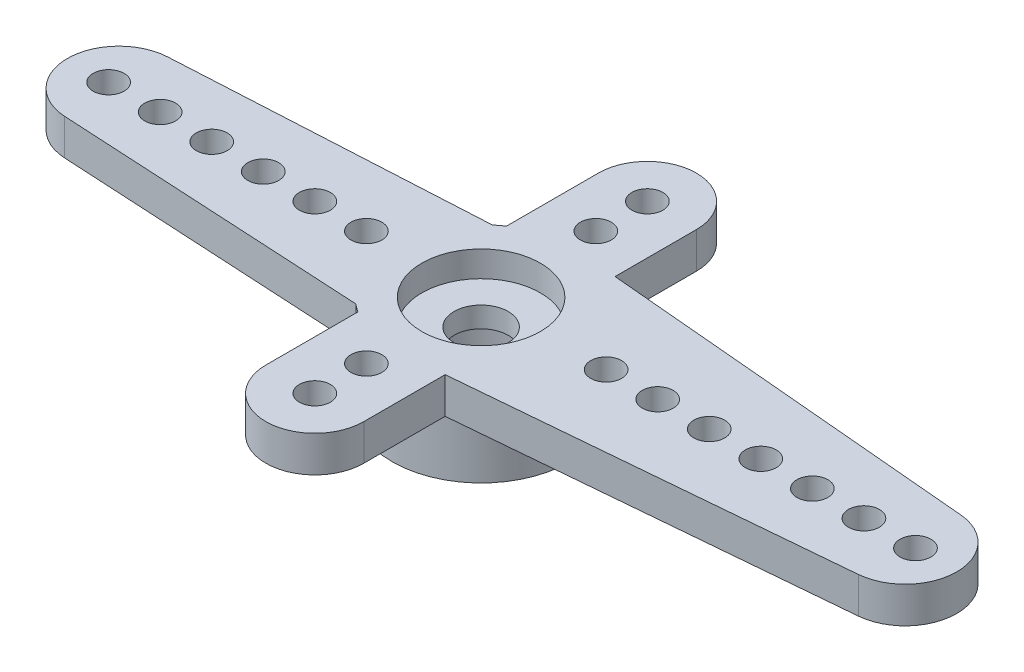
ISO-10303-21;
HEADER;
FILE_DESCRIPTION(('STEP AP214'),'2;1');
FILE_NAME('part.step','',(''),(''),'','','');
FILE_SCHEMA(('AUTOMOTIVE_DESIGN { 1 0 10303 214 1 1 1 1 }'));
ENDSEC;
DATA;
#1=APPLICATION_CONTEXT('core data for automotive mechanical design processes');
#2=APPLICATION_PROTOCOL_DEFINITION('international standard','automotive_design',2000,#1);
#3=PRODUCT_CONTEXT('',#1,'mechanical');
#4=PRODUCT('Part','Part','',(#3));
#5=PRODUCT_RELATED_PRODUCT_CATEGORY('part','',(#4));
#6=PRODUCT_DEFINITION_FORMATION('','',#4);
#7=PRODUCT_DEFINITION_CONTEXT('part definition',#1,'design');
#8=PRODUCT_DEFINITION('design','',#6,#7);
#9=PRODUCT_DEFINITION_SHAPE('','',#8);
#10=(LENGTH_UNIT() NAMED_UNIT(*) SI_UNIT(.MILLI.,.METRE.));
#11=(NAMED_UNIT(*) PLANE_ANGLE_UNIT() SI_UNIT($,.RADIAN.));
#12=(NAMED_UNIT(*) SI_UNIT($,.STERADIAN.) SOLID_ANGLE_UNIT());
#13=UNCERTAINTY_MEASURE_WITH_UNIT(LENGTH_MEASURE(1.E-05),#10,'distance_accuracy_value','');
#14=(GEOMETRIC_REPRESENTATION_CONTEXT(3) GLOBAL_UNCERTAINTY_ASSIGNED_CONTEXT((#13)) GLOBAL_UNIT_ASSIGNED_CONTEXT((#10,
#11,#12)) REPRESENTATION_CONTEXT('',''));
#15=CARTESIAN_POINT('',(0.,0.,0.));
#16=DIRECTION('',(0.,0.,1.));
#17=DIRECTION('',(1.,0.,0.));
#18=AXIS2_PLACEMENT_3D('',#15,#16,#17);
#19=CARTESIAN_POINT('',(4.85000000000001,0.,0.));
#20=DIRECTION('',(0.,1.,0.));
#21=DIRECTION('',(0.,0.,1.));
#22=AXIS2_PLACEMENT_3D('',#19,#20,#21);
#23=CYLINDRICAL_SURFACE('',#22,0.600000000000014);
#24=CARTESIAN_POINT('',(4.85000000000001,0.,0.));
#25=DIRECTION('',(0.,1.,0.));
#26=DIRECTION('',(0.,0.,1.));
#27=AXIS2_PLACEMENT_3D('',#24,#25,#26);
#28=CIRCLE('',#27,0.600000000000014);
#29=CARTESIAN_POINT('',(4.85000000000001,0.,0.600000000000014));
#30=VERTEX_POINT('',#29);
#31=EDGE_CURVE('E47',#30,#30,#28,.T.);
#32=ORIENTED_EDGE('',*,*,#31,.T.);
#33=EDGE_LOOP('',(#32));
#34=FACE_BOUND('',#33,.T.);
#35=CARTESIAN_POINT('',(4.85000000000001,-1.4,0.));
#36=DIRECTION('',(0.,1.,0.));
#37=DIRECTION('',(0.,0.,1.));
#38=AXIS2_PLACEMENT_3D('',#35,#36,#37);
#39=CIRCLE('',#38,0.600000000000014);
#40=CARTESIAN_POINT('',(4.85000000000001,-1.4,0.600000000000014));
#41=VERTEX_POINT('',#40);
#42=EDGE_CURVE('E12',#41,#41,#39,.T.);
#43=ORIENTED_EDGE('',*,*,#42,.F.);
#44=EDGE_LOOP('',(#43));
#45=FACE_BOUND('',#44,.T.);
#46=ADVANCED_FACE('F39',(#34,#45),#23,.F.);
#47=CARTESIAN_POINT('',(6.85000000000001,0.,0.));
#48=DIRECTION('',(0.,1.,0.));
#49=DIRECTION('',(0.,0.,1.));
#50=AXIS2_PLACEMENT_3D('',#47,#48,#49);
#51=CYLINDRICAL_SURFACE('',#50,0.600000000000014);
#52=CARTESIAN_POINT('',(6.85000000000001,0.,0.));
#53=DIRECTION('',(0.,1.,0.));
#54=DIRECTION('',(0.,0.,1.));
#55=AXIS2_PLACEMENT_3D('',#52,#53,#54);
#56=CIRCLE('',#55,0.600000000000014);
#57=CARTESIAN_POINT('',(6.85000000000001,0.,0.600000000000014));
#58=VERTEX_POINT('',#57);
#59=EDGE_CURVE('E322',#58,#58,#56,.T.);
#60=ORIENTED_EDGE('',*,*,#59,.T.);
#61=EDGE_LOOP('',(#60));
#62=FACE_BOUND('',#61,.T.);
#63=CARTESIAN_POINT('',(6.85000000000001,-1.4,0.));
#64=DIRECTION('',(0.,1.,0.));
#65=DIRECTION('',(0.,0.,1.));
#66=AXIS2_PLACEMENT_3D('',#63,#64,#65);
#67=CIRCLE('',#66,0.600000000000014);
#68=CARTESIAN_POINT('',(6.85000000000001,-1.4,0.600000000000014));
#69=VERTEX_POINT('',#68);
#70=EDGE_CURVE('E325',#69,#69,#67,.T.);
#71=ORIENTED_EDGE('',*,*,#70,.F.);
#72=EDGE_LOOP('',(#71));
#73=FACE_BOUND('',#72,.T.);
#74=ADVANCED_FACE('F399',(#62,#73),#51,.F.);
#75=CARTESIAN_POINT('',(8.85000000000001,0.,0.));
#76=DIRECTION('',(0.,1.,0.));
#77=DIRECTION('',(0.,0.,1.));
#78=AXIS2_PLACEMENT_3D('',#75,#76,#77);
#79=CYLINDRICAL_SURFACE('',#78,0.600000000000014);
#80=CARTESIAN_POINT('',(8.85000000000001,0.,0.));
#81=DIRECTION('',(0.,1.,0.));
#82=DIRECTION('',(0.,0.,1.));
#83=AXIS2_PLACEMENT_3D('',#80,#81,#82);
#84=CIRCLE('',#83,0.600000000000014);
#85=CARTESIAN_POINT('',(8.85000000000001,0.,0.600000000000014));
#86=VERTEX_POINT('',#85);
#87=EDGE_CURVE('E316',#86,#86,#84,.T.);
#88=ORIENTED_EDGE('',*,*,#87,.T.);
#89=EDGE_LOOP('',(#88));
#90=FACE_BOUND('',#89,.T.);
#91=CARTESIAN_POINT('',(8.85000000000001,-1.4,0.));
#92=DIRECTION('',(0.,1.,0.));
#93=DIRECTION('',(0.,0.,1.));
#94=AXIS2_PLACEMENT_3D('',#91,#92,#93);
#95=CIRCLE('',#94,0.600000000000014);
#96=CARTESIAN_POINT('',(8.85000000000001,-1.4,0.600000000000014));
#97=VERTEX_POINT('',#96);
#98=EDGE_CURVE('E319',#97,#97,#95,.T.);
#99=ORIENTED_EDGE('',*,*,#98,.F.);
#100=EDGE_LOOP('',(#99));
#101=FACE_BOUND('',#100,.T.);
#102=ADVANCED_FACE('F404',(#90,#101),#79,.F.);
#103=CARTESIAN_POINT('',(10.85,0.,0.));
#104=DIRECTION('',(0.,1.,0.));
#105=DIRECTION('',(0.,0.,1.));
#106=AXIS2_PLACEMENT_3D('',#103,#104,#105);
#107=CYLINDRICAL_SURFACE('',#106,0.600000000000014);
#108=CARTESIAN_POINT('',(10.85,0.,0.));
#109=DIRECTION('',(0.,1.,0.));
#110=DIRECTION('',(0.,0.,1.));
#111=AXIS2_PLACEMENT_3D('',#108,#109,#110);
#112=CIRCLE('',#111,0.600000000000014);
#113=CARTESIAN_POINT('',(10.85,0.,0.600000000000014));
#114=VERTEX_POINT('',#113);
#115=EDGE_CURVE('E310',#114,#114,#112,.T.);
#116=ORIENTED_EDGE('',*,*,#115,.T.);
#117=EDGE_LOOP('',(#116));
#118=FACE_BOUND('',#117,.T.);
#119=CARTESIAN_POINT('',(10.85,-1.4,0.));
#120=DIRECTION('',(0.,1.,0.));
#121=DIRECTION('',(0.,0.,1.));
#122=AXIS2_PLACEMENT_3D('',#119,#120,#121);
#123=CIRCLE('',#122,0.600000000000014);
#124=CARTESIAN_POINT('',(10.85,-1.4,0.600000000000014));
#125=VERTEX_POINT('',#124);
#126=EDGE_CURVE('E313',#125,#125,#123,.T.);
#127=ORIENTED_EDGE('',*,*,#126,.F.);
#128=EDGE_LOOP('',(#127));
#129=FACE_BOUND('',#128,.T.);
#130=ADVANCED_FACE('F548',(#118,#129),#107,.F.);
#131=CARTESIAN_POINT('',(12.85,0.,0.));
#132=DIRECTION('',(0.,1.,0.));
#133=DIRECTION('',(0.,0.,1.));
#134=AXIS2_PLACEMENT_3D('',#131,#132,#133);
#135=CYLINDRICAL_SURFACE('',#134,0.600000000000014);
#136=CARTESIAN_POINT('',(12.85,0.,0.));
#137=DIRECTION('',(0.,1.,0.));
#138=DIRECTION('',(0.,0.,1.));
#139=AXIS2_PLACEMENT_3D('',#136,#137,#138);
#140=CIRCLE('',#139,0.600000000000014);
#141=CARTESIAN_POINT('',(12.85,0.,0.600000000000014));
#142=VERTEX_POINT('',#141);
#143=EDGE_CURVE('E304',#142,#142,#140,.T.);
#144=ORIENTED_EDGE('',*,*,#143,.T.);
#145=EDGE_LOOP('',(#144));
#146=FACE_BOUND('',#145,.T.);
#147=CARTESIAN_POINT('',(12.85,-1.4,0.));
#148=DIRECTION('',(0.,1.,0.));
#149=DIRECTION('',(0.,0.,1.));
#150=AXIS2_PLACEMENT_3D('',#147,#148,#149);
#151=CIRCLE('',#150,0.600000000000014);
#152=CARTESIAN_POINT('',(12.85,-1.4,0.600000000000014));
#153=VERTEX_POINT('',#152);
#154=EDGE_CURVE('E307',#153,#153,#151,.T.);
#155=ORIENTED_EDGE('',*,*,#154,.F.);
#156=EDGE_LOOP('',(#155));
#157=FACE_BOUND('',#156,.T.);
#158=ADVANCED_FACE('F539',(#146,#157),#135,.F.);
#159=CARTESIAN_POINT('',(0.,-1.4,0.));
#160=DIRECTION('',(0.,1.,0.));
#161=DIRECTION('',(0.,0.,1.));
#162=AXIS2_PLACEMENT_3D('',#159,#160,#161);
#163=CYLINDRICAL_SURFACE('',#162,3.45);
#164=DIRECTION('',(0.,1.,0.));
#165=VECTOR('',#164,1.);
#166=CARTESIAN_POINT('',(-1.9,-1.4,-2.87967011999638));
#167=LINE('',#166,#165);
#168=CARTESIAN_POINT('',(-1.9,-1.4,-2.87967011999638));
#169=VERTEX_POINT('',#168);
#170=CARTESIAN_POINT('',(-1.9,0.,-2.87967011999639));
#171=VERTEX_POINT('',#170);
#172=EDGE_CURVE('E200',#169,#171,#167,.T.);
#173=ORIENTED_EDGE('',*,*,#172,.F.);
#174=CARTESIAN_POINT('',(0.,-1.4,0.));
#175=DIRECTION('',(0.,1.,0.));
#176=DIRECTION('',(0.,0.,1.));
#177=AXIS2_PLACEMENT_3D('',#174,#175,#176);
#178=CIRCLE('',#177,3.45);
#179=CARTESIAN_POINT('',(-1.9,-1.4,2.87967011999639));
#180=VERTEX_POINT('',#179);
#181=EDGE_CURVE('E223',#180,#169,#178,.T.);
#182=ORIENTED_EDGE('',*,*,#181,.F.);
#183=DIRECTION('',(0.,1.,0.));
#184=VECTOR('',#183,1.);
#185=CARTESIAN_POINT('',(-1.9,-1.4,2.87967011999639));
#186=LINE('',#185,#184);
#187=CARTESIAN_POINT('',(-1.9,0.,2.87967011999639));
#188=VERTEX_POINT('',#187);
#189=EDGE_CURVE('E202',#188,#180,#186,.F.);
#190=ORIENTED_EDGE('',*,*,#189,.F.);
#191=CARTESIAN_POINT('',(0.,0.,0.));
#192=DIRECTION('',(0.,1.,0.));
#193=DIRECTION('',(0.,0.,1.));
#194=AXIS2_PLACEMENT_3D('',#191,#192,#193);
#195=CIRCLE('',#194,3.45);
#196=CARTESIAN_POINT('',(-2.20907220343745,0.,2.65));
#197=VERTEX_POINT('',#196);
#198=EDGE_CURVE('E265',#197,#188,#195,.T.);
#199=ORIENTED_EDGE('',*,*,#198,.F.);
#200=DIRECTION('',(0.,1.,0.));
#201=VECTOR('',#200,1.);
#202=CARTESIAN_POINT('',(-2.20907220343745,-1.4,2.65));
#203=LINE('',#202,#201);
#204=CARTESIAN_POINT('',(-2.20907220343745,-1.4,2.65));
#205=VERTEX_POINT('',#204);
#206=EDGE_CURVE('E82',#205,#197,#203,.T.);
#207=ORIENTED_EDGE('',*,*,#206,.F.);
#208=CARTESIAN_POINT('',(0.,-1.4,0.));
#209=DIRECTION('',(0.,-1.,0.));
#210=DIRECTION('',(0.,0.,-1.));
#211=AXIS2_PLACEMENT_3D('',#208,#209,#210);
#212=CIRCLE('',#211,3.45);
#213=CARTESIAN_POINT('',(-2.20907220343745,-1.4,-2.65));
#214=VERTEX_POINT('',#213);
#215=EDGE_CURVE('E88',#205,#214,#212,.T.);
#216=ORIENTED_EDGE('',*,*,#215,.T.);
#217=DIRECTION('',(0.,1.,0.));
#218=VECTOR('',#217,1.);
#219=CARTESIAN_POINT('',(-2.20907220343745,-1.4,-2.65));
#220=LINE('',#219,#218);
#221=CARTESIAN_POINT('',(-2.20907220343745,0.,-2.65));
#222=VERTEX_POINT('',#221);
#223=EDGE_CURVE('E264',#214,#222,#220,.T.);
#224=ORIENTED_EDGE('',*,*,#223,.T.);
#225=EDGE_CURVE('E255',#171,#222,#195,.T.);
#226=ORIENTED_EDGE('',*,*,#225,.F.);
#227=EDGE_LOOP('',(#173,#182,#190,#199,#207,#216,#224,#226));
#228=FACE_BOUND('',#227,.T.);
#229=CARTESIAN_POINT('',(0.,-3.8,0.));
#230=DIRECTION('',(0.,1.,0.));
#231=DIRECTION('',(0.,0.,1.));
#232=AXIS2_PLACEMENT_3D('',#229,#230,#231);
#233=CIRCLE('',#232,3.45);
#234=CARTESIAN_POINT('',(0.,-3.8,3.45));
#235=VERTEX_POINT('',#234);
#236=EDGE_CURVE('E252',#235,#235,#233,.T.);
#237=ORIENTED_EDGE('',*,*,#236,.T.);
#238=EDGE_LOOP('',(#237));
#239=FACE_BOUND('',#238,.T.);
#240=ADVANCED_FACE('F376',(#228,#239),#163,.T.);
#241=CARTESIAN_POINT('',(-4.45,0.,0.));
#242=DIRECTION('',(0.,1.,0.));
#243=DIRECTION('',(0.,0.,1.));
#244=AXIS2_PLACEMENT_3D('',#241,#242,#243);
#245=CYLINDRICAL_SURFACE('',#244,0.600000000000014);
#246=CARTESIAN_POINT('',(-4.45,0.,0.));
#247=DIRECTION('',(0.,1.,0.));
#248=DIRECTION('',(0.,0.,1.));
#249=AXIS2_PLACEMENT_3D('',#246,#247,#248);
#250=CIRCLE('',#249,0.600000000000014);
#251=CARTESIAN_POINT('',(-4.45,0.,0.600000000000014));
#252=VERTEX_POINT('',#251);
#253=EDGE_CURVE('E298',#252,#252,#250,.T.);
#254=ORIENTED_EDGE('',*,*,#253,.T.);
#255=EDGE_LOOP('',(#254));
#256=FACE_BOUND('',#255,.T.);
#257=CARTESIAN_POINT('',(-4.45,-1.4,0.));
#258=DIRECTION('',(0.,1.,0.));
#259=DIRECTION('',(0.,0.,1.));
#260=AXIS2_PLACEMENT_3D('',#257,#258,#259);
#261=CIRCLE('',#260,0.600000000000014);
#262=CARTESIAN_POINT('',(-4.45,-1.4,0.600000000000014));
#263=VERTEX_POINT('',#262);
#264=EDGE_CURVE('E301',#263,#263,#261,.T.);
#265=ORIENTED_EDGE('',*,*,#264,.F.);
#266=EDGE_LOOP('',(#265));
#267=FACE_BOUND('',#266,.T.);
#268=ADVANCED_FACE('F538',(#256,#267),#245,.F.);
#269=CARTESIAN_POINT('',(-6.45,0.,0.));
#270=DIRECTION('',(0.,1.,0.));
#271=DIRECTION('',(0.,0.,1.));
#272=AXIS2_PLACEMENT_3D('',#269,#270,#271);
#273=CYLINDRICAL_SURFACE('',#272,0.600000000000014);
#274=CARTESIAN_POINT('',(-6.45,0.,0.));
#275=DIRECTION('',(0.,1.,0.));
#276=DIRECTION('',(0.,0.,1.));
#277=AXIS2_PLACEMENT_3D('',#274,#275,#276);
#278=CIRCLE('',#277,0.600000000000014);
#279=CARTESIAN_POINT('',(-6.45,0.,0.600000000000014));
#280=VERTEX_POINT('',#279);
#281=EDGE_CURVE('E292',#280,#280,#278,.T.);
#282=ORIENTED_EDGE('',*,*,#281,.T.);
#283=EDGE_LOOP('',(#282));
#284=FACE_BOUND('',#283,.T.);
#285=CARTESIAN_POINT('',(-6.45,-1.4,0.));
#286=DIRECTION('',(0.,1.,0.));
#287=DIRECTION('',(0.,0.,1.));
#288=AXIS2_PLACEMENT_3D('',#285,#286,#287);
#289=CIRCLE('',#288,0.600000000000014);
#290=CARTESIAN_POINT('',(-6.45,-1.4,0.600000000000014));
#291=VERTEX_POINT('',#290);
#292=EDGE_CURVE('E295',#291,#291,#289,.T.);
#293=ORIENTED_EDGE('',*,*,#292,.F.);
#294=EDGE_LOOP('',(#293));
#295=FACE_BOUND('',#294,.T.);
#296=ADVANCED_FACE('F545',(#284,#295),#273,.F.);
#297=CARTESIAN_POINT('',(-8.45,0.,0.));
#298=DIRECTION('',(0.,1.,0.));
#299=DIRECTION('',(0.,0.,1.));
#300=AXIS2_PLACEMENT_3D('',#297,#298,#299);
#301=CYLINDRICAL_SURFACE('',#300,0.600000000000014);
#302=CARTESIAN_POINT('',(-8.45,0.,0.));
#303=DIRECTION('',(0.,1.,0.));
#304=DIRECTION('',(0.,0.,1.));
#305=AXIS2_PLACEMENT_3D('',#302,#303,#304);
#306=CIRCLE('',#305,0.600000000000014);
#307=CARTESIAN_POINT('',(-8.45,0.,0.600000000000014));
#308=VERTEX_POINT('',#307);
#309=EDGE_CURVE('E286',#308,#308,#306,.T.);
#310=ORIENTED_EDGE('',*,*,#309,.T.);
#311=EDGE_LOOP('',(#310));
#312=FACE_BOUND('',#311,.T.);
#313=CARTESIAN_POINT('',(-8.45,-1.4,0.));
#314=DIRECTION('',(0.,1.,0.));
#315=DIRECTION('',(0.,0.,1.));
#316=AXIS2_PLACEMENT_3D('',#313,#314,#315);
#317=CIRCLE('',#316,0.600000000000014);
#318=CARTESIAN_POINT('',(-8.45,-1.4,0.600000000000014));
#319=VERTEX_POINT('',#318);
#320=EDGE_CURVE('E289',#319,#319,#317,.T.);
#321=ORIENTED_EDGE('',*,*,#320,.F.);
#322=EDGE_LOOP('',(#321));
#323=FACE_BOUND('',#322,.T.);
#324=ADVANCED_FACE('F554',(#312,#323),#301,.F.);
#325=CARTESIAN_POINT('',(-10.45,0.,0.));
#326=DIRECTION('',(0.,1.,0.));
#327=DIRECTION('',(0.,0.,1.));
#328=AXIS2_PLACEMENT_3D('',#325,#326,#327);
#329=CYLINDRICAL_SURFACE('',#328,0.600000000000014);
#330=CARTESIAN_POINT('',(-10.45,0.,0.));
#331=DIRECTION('',(0.,1.,0.));
#332=DIRECTION('',(0.,0.,1.));
#333=AXIS2_PLACEMENT_3D('',#330,#331,#332);
#334=CIRCLE('',#333,0.600000000000014);
#335=CARTESIAN_POINT('',(-10.45,0.,0.600000000000014));
#336=VERTEX_POINT('',#335);
#337=EDGE_CURVE('E276',#336,#336,#334,.T.);
#338=ORIENTED_EDGE('',*,*,#337,.T.);
#339=EDGE_LOOP('',(#338));
#340=FACE_BOUND('',#339,.T.);
#341=CARTESIAN_POINT('',(-10.45,-1.4,0.));
#342=DIRECTION('',(0.,1.,0.));
#343=DIRECTION('',(0.,0.,1.));
#344=AXIS2_PLACEMENT_3D('',#341,#342,#343);
#345=CIRCLE('',#344,0.600000000000014);
#346=CARTESIAN_POINT('',(-10.45,-1.4,0.600000000000014));
#347=VERTEX_POINT('',#346);
#348=EDGE_CURVE('E283',#347,#347,#345,.T.);
#349=ORIENTED_EDGE('',*,*,#348,.F.);
#350=EDGE_LOOP('',(#349));
#351=FACE_BOUND('',#350,.T.);
#352=ADVANCED_FACE('F394',(#340,#351),#329,.F.);
#353=CARTESIAN_POINT('',(0.,-1.4,0.));
#354=DIRECTION('',(0.,1.,0.));
#355=DIRECTION('',(0.,0.,1.));
#356=AXIS2_PLACEMENT_3D('',#353,#354,#355);
#357=PLANE('',#356);
#358=CARTESIAN_POINT('',(-12.45,-1.4,0.));
#359=DIRECTION('',(0.,1.,0.));
#360=DIRECTION('',(0.,0.,1.));
#361=AXIS2_PLACEMENT_3D('',#358,#359,#360);
#362=CIRCLE('',#361,0.600000000000014);
#363=CARTESIAN_POINT('',(-12.45,-1.4,0.600000000000014));
#364=VERTEX_POINT('',#363);
#365=EDGE_CURVE('E242',#364,#364,#362,.T.);
#366=ORIENTED_EDGE('',*,*,#365,.T.);
#367=EDGE_LOOP('',(#366));
#368=FACE_BOUND('',#367,.T.);
#369=CARTESIAN_POINT('',(-14.45,-1.4,0.));
#370=DIRECTION('',(0.,1.,0.));
#371=DIRECTION('',(0.,0.,1.));
#372=AXIS2_PLACEMENT_3D('',#369,#370,#371);
#373=CIRCLE('',#372,0.600000000000014);
#374=CARTESIAN_POINT('',(-14.45,-1.4,0.600000000000014));
#375=VERTEX_POINT('',#374);
#376=EDGE_CURVE('E248',#375,#375,#373,.T.);
#377=ORIENTED_EDGE('',*,*,#376,.T.);
#378=EDGE_LOOP('',(#377));
#379=FACE_BOUND('',#378,.T.);
#380=ORIENTED_EDGE('',*,*,#215,.F.);
#381=DIRECTION('',(0.998510440144325,0.,0.0545609835210727));
#382=VECTOR('',#381,1.);
#383=CARTESIAN_POINT('',(-2.20907220343745,-1.4,2.65));
#384=LINE('',#383,#382);
#385=CARTESIAN_POINT('',(-14.1591219670421,-1.4,1.99702088028865));
#386=VERTEX_POINT('',#385);
#387=EDGE_CURVE('E262',#386,#205,#384,.T.);
#388=ORIENTED_EDGE('',*,*,#387,.F.);
#389=CARTESIAN_POINT('',(-14.05,-1.4,0.));
#390=DIRECTION('',(0.,1.,0.));
#391=DIRECTION('',(0.,0.,1.));
#392=AXIS2_PLACEMENT_3D('',#389,#390,#391);
#393=CIRCLE('',#392,2.);
#394=CARTESIAN_POINT('',(-14.1591219670421,-1.4,-1.99702088028865));
#395=VERTEX_POINT('',#394);
#396=EDGE_CURVE('E259',#395,#386,#393,.T.);
#397=ORIENTED_EDGE('',*,*,#396,.F.);
#398=DIRECTION('',(-0.998510440144325,0.,0.0545609835210729));
#399=VECTOR('',#398,1.);
#400=CARTESIAN_POINT('',(-14.1591219670421,-1.4,-1.99702088028865));
#401=LINE('',#400,#399);
#402=EDGE_CURVE('E256',#214,#395,#401,.T.);
#403=ORIENTED_EDGE('',*,*,#402,.F.);
#404=EDGE_LOOP('',(#380,#388,#397,#403));
#405=FACE_BOUND('',#404,.T.);
#406=ORIENTED_EDGE('',*,*,#348,.T.);
#407=EDGE_LOOP('',(#406));
#408=FACE_BOUND('',#407,.T.);
#409=ORIENTED_EDGE('',*,*,#320,.T.);
#410=EDGE_LOOP('',(#409));
#411=FACE_BOUND('',#410,.T.);
#412=ORIENTED_EDGE('',*,*,#292,.T.);
#413=EDGE_LOOP('',(#412));
#414=FACE_BOUND('',#413,.T.);
#415=ORIENTED_EDGE('',*,*,#264,.T.);
#416=EDGE_LOOP('',(#415));
#417=FACE_BOUND('',#416,.T.);
#418=ADVANCED_FACE('F387',(#368,#379,#405,#408,#411,#414,#417),#357,.F.);
#419=CARTESIAN_POINT('',(-2.20907220343745,-1.4,2.65));
#420=DIRECTION('',(-0.0545609835210727,0.,0.998510440144325));
#421=DIRECTION('',(0.998510440144325,0.,0.0545609835210727));
#422=AXIS2_PLACEMENT_3D('',#419,#420,#421);
#423=PLANE('',#422);
#424=DIRECTION('',(0.998510440144325,0.,0.0545609835210727));
#425=VECTOR('',#424,1.);
#426=CARTESIAN_POINT('',(-2.20907220343745,0.,2.65));
#427=LINE('',#426,#425);
#428=CARTESIAN_POINT('',(-14.1591219670421,0.,1.99702088028865));
#429=VERTEX_POINT('',#428);
#430=EDGE_CURVE('E260',#429,#197,#427,.T.);
#431=ORIENTED_EDGE('',*,*,#430,.F.);
#432=DIRECTION('',(0.,1.,0.));
#433=VECTOR('',#432,1.);
#434=CARTESIAN_POINT('',(-14.1591219670421,-1.4,1.99702088028865));
#435=LINE('',#434,#433);
#436=EDGE_CURVE('E64',#386,#429,#435,.T.);
#437=ORIENTED_EDGE('',*,*,#436,.F.);
#438=ORIENTED_EDGE('',*,*,#387,.T.);
#439=ORIENTED_EDGE('',*,*,#206,.T.);
#440=EDGE_LOOP('',(#431,#437,#438,#439));
#441=FACE_BOUND('',#440,.T.);
#442=ADVANCED_FACE('F384',(#441),#423,.T.);
#443=CARTESIAN_POINT('',(-14.05,-1.4,0.));
#444=DIRECTION('',(0.,1.,0.));
#445=DIRECTION('',(0.,0.,1.));
#446=AXIS2_PLACEMENT_3D('',#443,#444,#445);
#447=CYLINDRICAL_SURFACE('',#446,2.);
#448=CARTESIAN_POINT('',(-14.05,0.,0.));
#449=DIRECTION('',(0.,1.,0.));
#450=DIRECTION('',(0.,0.,1.));
#451=AXIS2_PLACEMENT_3D('',#448,#449,#450);
#452=CIRCLE('',#451,2.);
#453=CARTESIAN_POINT('',(-14.1591219670421,0.,-1.99702088028865));
#454=VERTEX_POINT('',#453);
#455=EDGE_CURVE('E270',#454,#429,#452,.T.);
#456=ORIENTED_EDGE('',*,*,#455,.F.);
#457=DIRECTION('',(0.,1.,0.));
#458=VECTOR('',#457,1.);
#459=CARTESIAN_POINT('',(-14.1591219670421,-1.4,-1.99702088028865));
#460=LINE('',#459,#458);
#461=EDGE_CURVE('E278',#395,#454,#460,.T.);
#462=ORIENTED_EDGE('',*,*,#461,.F.);
#463=ORIENTED_EDGE('',*,*,#396,.T.);
#464=ORIENTED_EDGE('',*,*,#436,.T.);
#465=EDGE_LOOP('',(#456,#462,#463,#464));
#466=FACE_BOUND('',#465,.T.);
#467=ADVANCED_FACE('F386',(#466),#447,.T.);
#468=CARTESIAN_POINT('',(-14.1591219670421,-1.4,-1.99702088028865));
#469=DIRECTION('',(-0.0545609835210729,0.,-0.998510440144325));
#470=DIRECTION('',(-0.998510440144325,0.,0.0545609835210729));
#471=AXIS2_PLACEMENT_3D('',#468,#469,#470);
#472=PLANE('',#471);
#473=DIRECTION('',(-0.998510440144325,0.,0.0545609835210729));
#474=VECTOR('',#473,1.);
#475=CARTESIAN_POINT('',(-14.1591219670421,0.,-1.99702088028865));
#476=LINE('',#475,#474);
#477=EDGE_CURVE('E267',#222,#454,#476,.T.);
#478=ORIENTED_EDGE('',*,*,#477,.F.);
#479=ORIENTED_EDGE('',*,*,#223,.F.);
#480=ORIENTED_EDGE('',*,*,#402,.T.);
#481=ORIENTED_EDGE('',*,*,#461,.T.);
#482=EDGE_LOOP('',(#478,#479,#480,#481));
#483=FACE_BOUND('',#482,.T.);
#484=ADVANCED_FACE('F381',(#483),#472,.T.);
#485=CARTESIAN_POINT('',(0.,0.,0.));
#486=DIRECTION('',(0.,1.,0.));
#487=DIRECTION('',(0.,0.,1.));
#488=AXIS2_PLACEMENT_3D('',#485,#486,#487);
#489=PLANE('',#488);
#490=CARTESIAN_POINT('',(0.,0.,0.));
#491=DIRECTION('',(0.,1.,0.));
#492=DIRECTION('',(0.,0.,1.));
#493=AXIS2_PLACEMENT_3D('',#490,#491,#492);
#494=CIRCLE('',#493,2.30000000000001);
#495=CARTESIAN_POINT('',(0.,0.,2.30000000000001));
#496=VERTEX_POINT('',#495);
#497=EDGE_CURVE('E454',#496,#496,#494,.T.);
#498=ORIENTED_EDGE('',*,*,#497,.F.);
#499=EDGE_LOOP('',(#498));
#500=FACE_BOUND('',#499,.T.);
#501=CARTESIAN_POINT('',(0.,0.,-4.45));
#502=DIRECTION('',(0.,1.,0.));
#503=DIRECTION('',(0.,0.,1.));
#504=AXIS2_PLACEMENT_3D('',#501,#502,#503);
#505=CIRCLE('',#504,0.600000000000014);
#506=CARTESIAN_POINT('',(0.,0.,-3.84999999999999));
#507=VERTEX_POINT('',#506);
#508=EDGE_CURVE('E336',#507,#507,#505,.T.);
#509=ORIENTED_EDGE('',*,*,#508,.F.);
#510=EDGE_LOOP('',(#509));
#511=FACE_BOUND('',#510,.T.);
#512=CARTESIAN_POINT('',(0.,0.,-6.45));
#513=DIRECTION('',(0.,1.,0.));
#514=DIRECTION('',(0.,0.,1.));
#515=AXIS2_PLACEMENT_3D('',#512,#513,#514);
#516=CIRCLE('',#515,0.600000000000014);
#517=CARTESIAN_POINT('',(0.,0.,-5.84999999999999));
#518=VERTEX_POINT('',#517);
#519=EDGE_CURVE('E333',#518,#518,#516,.T.);
#520=ORIENTED_EDGE('',*,*,#519,.F.);
#521=EDGE_LOOP('',(#520));
#522=FACE_BOUND('',#521,.T.);
#523=CARTESIAN_POINT('',(0.,0.,4.45));
#524=DIRECTION('',(0.,1.,0.));
#525=DIRECTION('',(0.,0.,1.));
#526=AXIS2_PLACEMENT_3D('',#523,#524,#525);
#527=CIRCLE('',#526,0.600000000000014);
#528=CARTESIAN_POINT('',(0.,0.,5.05000000000001));
#529=VERTEX_POINT('',#528);
#530=EDGE_CURVE('E332',#529,#529,#527,.T.);
#531=ORIENTED_EDGE('',*,*,#530,.F.);
#532=EDGE_LOOP('',(#531));
#533=FACE_BOUND('',#532,.T.);
#534=CARTESIAN_POINT('',(0.,0.,6.45));
#535=DIRECTION('',(0.,1.,0.));
#536=DIRECTION('',(0.,0.,1.));
#537=AXIS2_PLACEMENT_3D('',#534,#535,#536);
#538=CIRCLE('',#537,0.600000000000014);
#539=CARTESIAN_POINT('',(0.,0.,7.05000000000001));
#540=VERTEX_POINT('',#539);
#541=EDGE_CURVE('E180',#540,#540,#538,.T.);
#542=ORIENTED_EDGE('',*,*,#541,.F.);
#543=EDGE_LOOP('',(#542));
#544=FACE_BOUND('',#543,.T.);
#545=DIRECTION('',(0.,0.,1.));
#546=VECTOR('',#545,1.);
#547=CARTESIAN_POINT('',(-1.9,0.,6.45));
#548=LINE('',#547,#546);
#549=CARTESIAN_POINT('',(-1.9,0.,-6.45));
#550=VERTEX_POINT('',#549);
#551=EDGE_CURVE('E159',#550,#171,#548,.T.);
#552=ORIENTED_EDGE('',*,*,#551,.T.);
#553=ORIENTED_EDGE('',*,*,#225,.T.);
#554=ORIENTED_EDGE('',*,*,#477,.T.);
#555=ORIENTED_EDGE('',*,*,#455,.T.);
#556=ORIENTED_EDGE('',*,*,#430,.T.);
#557=ORIENTED_EDGE('',*,*,#198,.T.);
#558=CARTESIAN_POINT('',(-1.9,0.,6.45));
#559=VERTEX_POINT('',#558);
#560=EDGE_CURVE('E175',#188,#559,#548,.T.);
#561=ORIENTED_EDGE('',*,*,#560,.T.);
#562=CARTESIAN_POINT('',(0.,0.,6.45));
#563=DIRECTION('',(0.,1.,0.));
#564=DIRECTION('',(0.,0.,1.));
#565=AXIS2_PLACEMENT_3D('',#562,#563,#564);
#566=CIRCLE('',#565,1.9);
#567=CARTESIAN_POINT('',(1.9,0.,6.45));
#568=VERTEX_POINT('',#567);
#569=EDGE_CURVE('E155',#559,#568,#566,.T.);
#570=ORIENTED_EDGE('',*,*,#569,.T.);
#571=DIRECTION('',(0.,0.,-1.));
#572=VECTOR('',#571,1.);
#573=CARTESIAN_POINT('',(1.9,0.,6.45));
#574=LINE('',#573,#572);
#575=CARTESIAN_POINT('',(1.9,0.,3.29534969801629));
#576=VERTEX_POINT('',#575);
#577=EDGE_CURVE('E162',#568,#576,#574,.T.);
#578=ORIENTED_EDGE('',*,*,#577,.T.);
#579=DIRECTION('',(0.996107574964981,0.,-0.0881458966565349));
#580=VECTOR('',#579,1.);
#581=CARTESIAN_POINT('',(16.6262917933131,0.,1.99221514992996));
#582=LINE('',#581,#580);
#583=CARTESIAN_POINT('',(16.6262917933131,0.,1.99221514992996));
#584=VERTEX_POINT('',#583);
#585=EDGE_CURVE('E217',#576,#584,#582,.T.);
#586=ORIENTED_EDGE('',*,*,#585,.T.);
#587=CARTESIAN_POINT('',(16.45,0.,0.));
#588=DIRECTION('',(0.,1.,0.));
#589=DIRECTION('',(0.,0.,-1.));
#590=AXIS2_PLACEMENT_3D('',#587,#588,#589);
#591=CIRCLE('',#590,2.);
#592=CARTESIAN_POINT('',(16.6262917933131,0.,-1.99221514992996));
#593=VERTEX_POINT('',#592);
#594=EDGE_CURVE('E227',#584,#593,#591,.T.);
#595=ORIENTED_EDGE('',*,*,#594,.T.);
#596=DIRECTION('',(-0.996107574964981,0.,-0.0881458966565349));
#597=VECTOR('',#596,1.);
#598=CARTESIAN_POINT('',(0.304103343465045,0.,-3.43657113362918));
#599=LINE('',#598,#597);
#600=CARTESIAN_POINT('',(1.9,0.,-3.29534969801628));
#601=VERTEX_POINT('',#600);
#602=EDGE_CURVE('E230',#593,#601,#599,.T.);
#603=ORIENTED_EDGE('',*,*,#602,.T.);
#604=CARTESIAN_POINT('',(1.9,0.,-6.45));
#605=VERTEX_POINT('',#604);
#606=EDGE_CURVE('E169',#601,#605,#574,.T.);
#607=ORIENTED_EDGE('',*,*,#606,.T.);
#608=CARTESIAN_POINT('',(0.,0.,-6.45));
#609=DIRECTION('',(0.,1.,0.));
#610=DIRECTION('',(0.,0.,1.));
#611=AXIS2_PLACEMENT_3D('',#608,#609,#610);
#612=CIRCLE('',#611,1.9);
#613=EDGE_CURVE('E168',#605,#550,#612,.T.);
#614=ORIENTED_EDGE('',*,*,#613,.T.);
#615=EDGE_LOOP('',(#552,#553,#554,#555,#556,#557,#561,#570,#578,#586,#595,#603,#607,#614));
#616=FACE_BOUND('',#615,.T.);
#617=CARTESIAN_POINT('',(14.85,0.,0.));
#618=DIRECTION('',(0.,1.,0.));
#619=DIRECTION('',(0.,0.,1.));
#620=AXIS2_PLACEMENT_3D('',#617,#618,#619);
#621=CIRCLE('',#620,0.600000000000014);
#622=CARTESIAN_POINT('',(14.85,0.,0.600000000000014));
#623=VERTEX_POINT('',#622);
#624=EDGE_CURVE('E205',#623,#623,#621,.T.);
#625=ORIENTED_EDGE('',*,*,#624,.F.);
#626=EDGE_LOOP('',(#625));
#627=FACE_BOUND('',#626,.T.);
#628=CARTESIAN_POINT('',(16.85,0.,0.));
#629=DIRECTION('',(0.,1.,0.));
#630=DIRECTION('',(0.,0.,1.));
#631=AXIS2_PLACEMENT_3D('',#628,#629,#630);
#632=CIRCLE('',#631,0.600000000000014);
#633=CARTESIAN_POINT('',(16.85,0.,0.600000000000014));
#634=VERTEX_POINT('',#633);
#635=EDGE_CURVE('E211',#634,#634,#632,.T.);
#636=ORIENTED_EDGE('',*,*,#635,.F.);
#637=EDGE_LOOP('',(#636));
#638=FACE_BOUND('',#637,.T.);
#639=ORIENTED_EDGE('',*,*,#143,.F.);
#640=EDGE_LOOP('',(#639));
#641=FACE_BOUND('',#640,.T.);
#642=ORIENTED_EDGE('',*,*,#115,.F.);
#643=EDGE_LOOP('',(#642));
#644=FACE_BOUND('',#643,.T.);
#645=ORIENTED_EDGE('',*,*,#87,.F.);
#646=EDGE_LOOP('',(#645));
#647=FACE_BOUND('',#646,.T.);
#648=ORIENTED_EDGE('',*,*,#59,.F.);
#649=EDGE_LOOP('',(#648));
#650=FACE_BOUND('',#649,.T.);
#651=ORIENTED_EDGE('',*,*,#31,.F.);
#652=EDGE_LOOP('',(#651));
#653=FACE_BOUND('',#652,.T.);
#654=ORIENTED_EDGE('',*,*,#253,.F.);
#655=EDGE_LOOP('',(#654));
#656=FACE_BOUND('',#655,.T.);
#657=ORIENTED_EDGE('',*,*,#281,.F.);
#658=EDGE_LOOP('',(#657));
#659=FACE_BOUND('',#658,.T.);
#660=ORIENTED_EDGE('',*,*,#309,.F.);
#661=EDGE_LOOP('',(#660));
#662=FACE_BOUND('',#661,.T.);
#663=ORIENTED_EDGE('',*,*,#337,.F.);
#664=EDGE_LOOP('',(#663));
#665=FACE_BOUND('',#664,.T.);
#666=CARTESIAN_POINT('',(-14.45,0.,0.));
#667=DIRECTION('',(0.,1.,0.));
#668=DIRECTION('',(0.,0.,1.));
#669=AXIS2_PLACEMENT_3D('',#666,#667,#668);
#670=CIRCLE('',#669,0.600000000000014);
#671=CARTESIAN_POINT('',(-14.45,0.,0.600000000000014));
#672=VERTEX_POINT('',#671);
#673=EDGE_CURVE('E245',#672,#672,#670,.T.);
#674=ORIENTED_EDGE('',*,*,#673,.F.);
#675=EDGE_LOOP('',(#674));
#676=FACE_BOUND('',#675,.T.);
#677=CARTESIAN_POINT('',(-12.45,0.,0.));
#678=DIRECTION('',(0.,1.,0.));
#679=DIRECTION('',(0.,0.,1.));
#680=AXIS2_PLACEMENT_3D('',#677,#678,#679);
#681=CIRCLE('',#680,0.600000000000014);
#682=CARTESIAN_POINT('',(-12.45,0.,0.600000000000014));
#683=VERTEX_POINT('',#682);
#684=EDGE_CURVE('E239',#683,#683,#681,.T.);
#685=ORIENTED_EDGE('',*,*,#684,.F.);
#686=EDGE_LOOP('',(#685));
#687=FACE_BOUND('',#686,.T.);
#688=ADVANCED_FACE('F172',(#500,#511,#522,#533,#544,#616,#627,#638,#641,#644,#647,#650,#653,
#656,#659,#662,#665,#676,#687),#489,.T.);
#689=CARTESIAN_POINT('',(0.,-3.8,0.));
#690=DIRECTION('',(0.,1.,0.));
#691=DIRECTION('',(0.,0.,1.));
#692=AXIS2_PLACEMENT_3D('',#689,#690,#691);
#693=PLANE('',#692);
#694=CARTESIAN_POINT('',(0.,-3.8,0.));
#695=DIRECTION('',(0.,-1.,0.));
#696=DIRECTION('',(0.,0.,-1.));
#697=AXIS2_PLACEMENT_3D('',#694,#695,#696);
#698=CIRCLE('',#697,2.50000000000001);
#699=CARTESIAN_POINT('',(0.,-3.8,-2.50000000000001));
#700=VERTEX_POINT('',#699);
#701=EDGE_CURVE('E347',#700,#700,#698,.T.);
#702=ORIENTED_EDGE('',*,*,#701,.F.);
#703=EDGE_LOOP('',(#702));
#704=FACE_BOUND('',#703,.T.);
#705=ORIENTED_EDGE('',*,*,#236,.F.);
#706=EDGE_LOOP('',(#705));
#707=FACE_BOUND('',#706,.T.);
#708=ADVANCED_FACE('F441',(#704,#707),#693,.F.);
#709=CARTESIAN_POINT('',(-14.45,0.,0.));
#710=DIRECTION('',(0.,1.,0.));
#711=DIRECTION('',(0.,0.,1.));
#712=AXIS2_PLACEMENT_3D('',#709,#710,#711);
#713=CYLINDRICAL_SURFACE('',#712,0.600000000000014);
#714=ORIENTED_EDGE('',*,*,#673,.T.);
#715=EDGE_LOOP('',(#714));
#716=FACE_BOUND('',#715,.T.);
#717=ORIENTED_EDGE('',*,*,#376,.F.);
#718=EDGE_LOOP('',(#717));
#719=FACE_BOUND('',#718,.T.);
#720=ADVANCED_FACE('F437',(#716,#719),#713,.F.);
#721=CARTESIAN_POINT('',(-12.45,0.,0.));
#722=DIRECTION('',(0.,1.,0.));
#723=DIRECTION('',(0.,0.,1.));
#724=AXIS2_PLACEMENT_3D('',#721,#722,#723);
#725=CYLINDRICAL_SURFACE('',#724,0.600000000000014);
#726=ORIENTED_EDGE('',*,*,#684,.T.);
#727=EDGE_LOOP('',(#726));
#728=FACE_BOUND('',#727,.T.);
#729=ORIENTED_EDGE('',*,*,#365,.F.);
#730=EDGE_LOOP('',(#729));
#731=FACE_BOUND('',#730,.T.);
#732=ADVANCED_FACE('F430',(#728,#731),#725,.F.);
#733=CARTESIAN_POINT('',(0.304103343465045,-20.8039596499173,-3.43657113362918));
#734=DIRECTION('',(0.0881458966565349,0.,-0.996107574964981));
#735=DIRECTION('',(-0.996107574964981,0.,-0.0881458966565349));
#736=AXIS2_PLACEMENT_3D('',#733,#734,#735);
#737=PLANE('',#736);
#738=DIRECTION('',(0.,-1.,0.));
#739=VECTOR('',#738,1.);
#740=CARTESIAN_POINT('',(1.9,-20.8039596499173,-3.29534969801628));
#741=LINE('',#740,#739);
#742=CARTESIAN_POINT('',(1.9,-1.4,-3.29534969801628));
#743=VERTEX_POINT('',#742);
#744=EDGE_CURVE('E198',#601,#743,#741,.T.);
#745=ORIENTED_EDGE('',*,*,#744,.F.);
#746=ORIENTED_EDGE('',*,*,#602,.F.);
#747=DIRECTION('',(0.,1.,0.));
#748=VECTOR('',#747,1.);
#749=CARTESIAN_POINT('',(16.6262917933131,-20.8039596499173,-1.99221514992996));
#750=LINE('',#749,#748);
#751=CARTESIAN_POINT('',(16.6262917933131,-1.4,-1.99221514992996));
#752=VERTEX_POINT('',#751);
#753=EDGE_CURVE('E221',#752,#593,#750,.T.);
#754=ORIENTED_EDGE('',*,*,#753,.F.);
#755=DIRECTION('',(0.996107574964981,0.,0.0881458966565349));
#756=VECTOR('',#755,1.);
#757=CARTESIAN_POINT('',(0.304103343465045,-1.4,-3.43657113362918));
#758=LINE('',#757,#756);
#759=EDGE_CURVE('E220',#743,#752,#758,.T.);
#760=ORIENTED_EDGE('',*,*,#759,.F.);
#761=EDGE_LOOP('',(#745,#746,#754,#760));
#762=FACE_BOUND('',#761,.T.);
#763=ADVANCED_FACE('F427',(#762),#737,.T.);
#764=CARTESIAN_POINT('',(16.45,-20.8039596499173,0.));
#765=DIRECTION('',(0.,1.,0.));
#766=DIRECTION('',(0.,0.,1.));
#767=AXIS2_PLACEMENT_3D('',#764,#765,#766);
#768=CYLINDRICAL_SURFACE('',#767,2.);
#769=CARTESIAN_POINT('',(16.45,-1.4,0.));
#770=DIRECTION('',(0.,1.,0.));
#771=DIRECTION('',(0.,0.,1.));
#772=AXIS2_PLACEMENT_3D('',#769,#770,#771);
#773=CIRCLE('',#772,2.);
#774=CARTESIAN_POINT('',(16.6262917933131,-1.4,1.99221514992996));
#775=VERTEX_POINT('',#774);
#776=EDGE_CURVE('E218',#752,#775,#773,.F.);
#777=ORIENTED_EDGE('',*,*,#776,.F.);
#778=ORIENTED_EDGE('',*,*,#753,.T.);
#779=ORIENTED_EDGE('',*,*,#594,.F.);
#780=DIRECTION('',(0.,1.,0.));
#781=VECTOR('',#780,1.);
#782=CARTESIAN_POINT('',(16.6262917933131,-20.8039596499173,1.99221514992996));
#783=LINE('',#782,#781);
#784=EDGE_CURVE('E233',#775,#584,#783,.T.);
#785=ORIENTED_EDGE('',*,*,#784,.F.);
#786=EDGE_LOOP('',(#777,#778,#779,#785));
#787=FACE_BOUND('',#786,.T.);
#788=ADVANCED_FACE('F421',(#787),#768,.T.);
#789=CARTESIAN_POINT('',(16.6262917933131,-20.8039596499173,1.99221514992996));
#790=DIRECTION('',(0.0881458966565349,0.,0.996107574964981));
#791=DIRECTION('',(0.996107574964981,0.,-0.0881458966565349));
#792=AXIS2_PLACEMENT_3D('',#789,#790,#791);
#793=PLANE('',#792);
#794=DIRECTION('',(0.,1.,0.));
#795=VECTOR('',#794,1.);
#796=CARTESIAN_POINT('',(1.9,-20.8039596499173,3.29534969801629));
#797=LINE('',#796,#795);
#798=CARTESIAN_POINT('',(1.9,-1.4,3.29534969801629));
#799=VERTEX_POINT('',#798);
#800=EDGE_CURVE('E165',#799,#576,#797,.T.);
#801=ORIENTED_EDGE('',*,*,#800,.F.);
#802=DIRECTION('',(-0.996107574964981,0.,0.0881458966565349));
#803=VECTOR('',#802,1.);
#804=CARTESIAN_POINT('',(16.6262917933131,-1.4,1.99221514992996));
#805=LINE('',#804,#803);
#806=EDGE_CURVE('E225',#775,#799,#805,.T.);
#807=ORIENTED_EDGE('',*,*,#806,.F.);
#808=ORIENTED_EDGE('',*,*,#784,.T.);
#809=ORIENTED_EDGE('',*,*,#585,.F.);
#810=EDGE_LOOP('',(#801,#807,#808,#809));
#811=FACE_BOUND('',#810,.T.);
#812=ADVANCED_FACE('F412',(#811),#793,.T.);
#813=CARTESIAN_POINT('',(0.,-1.4,0.));
#814=DIRECTION('',(0.,1.,0.));
#815=DIRECTION('',(0.,0.,1.));
#816=AXIS2_PLACEMENT_3D('',#813,#814,#815);
#817=PLANE('',#816);
#818=CARTESIAN_POINT('',(0.,-1.4,-4.45));
#819=DIRECTION('',(0.,1.,0.));
#820=DIRECTION('',(0.,0.,1.));
#821=AXIS2_PLACEMENT_3D('',#818,#819,#820);
#822=CIRCLE('',#821,0.600000000000014);
#823=CARTESIAN_POINT('',(0.,-1.4,-3.84999999999999));
#824=VERTEX_POINT('',#823);
#825=EDGE_CURVE('E334',#824,#824,#822,.T.);
#826=ORIENTED_EDGE('',*,*,#825,.T.);
#827=EDGE_LOOP('',(#826));
#828=FACE_BOUND('',#827,.T.);
#829=CARTESIAN_POINT('',(0.,-1.4,-6.45));
#830=DIRECTION('',(0.,1.,0.));
#831=DIRECTION('',(0.,0.,1.));
#832=AXIS2_PLACEMENT_3D('',#829,#830,#831);
#833=CIRCLE('',#832,0.600000000000014);
#834=CARTESIAN_POINT('',(0.,-1.4,-5.84999999999999));
#835=VERTEX_POINT('',#834);
#836=EDGE_CURVE('E330',#835,#835,#833,.T.);
#837=ORIENTED_EDGE('',*,*,#836,.T.);
#838=EDGE_LOOP('',(#837));
#839=FACE_BOUND('',#838,.T.);
#840=CARTESIAN_POINT('',(0.,-1.4,4.45));
#841=DIRECTION('',(0.,1.,0.));
#842=DIRECTION('',(0.,0.,1.));
#843=AXIS2_PLACEMENT_3D('',#840,#841,#842);
#844=CIRCLE('',#843,0.600000000000014);
#845=CARTESIAN_POINT('',(0.,-1.4,5.05000000000001));
#846=VERTEX_POINT('',#845);
#847=EDGE_CURVE('E353',#846,#846,#844,.T.);
#848=ORIENTED_EDGE('',*,*,#847,.T.);
#849=EDGE_LOOP('',(#848));
#850=FACE_BOUND('',#849,.T.);
#851=CARTESIAN_POINT('',(0.,-1.4,6.45));
#852=DIRECTION('',(0.,1.,0.));
#853=DIRECTION('',(0.,0.,1.));
#854=AXIS2_PLACEMENT_3D('',#851,#852,#853);
#855=CIRCLE('',#854,0.600000000000014);
#856=CARTESIAN_POINT('',(0.,-1.4,7.05000000000001));
#857=VERTEX_POINT('',#856);
#858=EDGE_CURVE('E177',#857,#857,#855,.T.);
#859=ORIENTED_EDGE('',*,*,#858,.T.);
#860=EDGE_LOOP('',(#859));
#861=FACE_BOUND('',#860,.T.);
#862=CARTESIAN_POINT('',(14.85,-1.4,0.));
#863=DIRECTION('',(0.,1.,0.));
#864=DIRECTION('',(0.,0.,1.));
#865=AXIS2_PLACEMENT_3D('',#862,#863,#864);
#866=CIRCLE('',#865,0.600000000000014);
#867=CARTESIAN_POINT('',(14.85,-1.4,0.600000000000014));
#868=VERTEX_POINT('',#867);
#869=EDGE_CURVE('E208',#868,#868,#866,.T.);
#870=ORIENTED_EDGE('',*,*,#869,.T.);
#871=EDGE_LOOP('',(#870));
#872=FACE_BOUND('',#871,.T.);
#873=CARTESIAN_POINT('',(16.85,-1.4,0.));
#874=DIRECTION('',(0.,1.,0.));
#875=DIRECTION('',(0.,0.,1.));
#876=AXIS2_PLACEMENT_3D('',#873,#874,#875);
#877=CIRCLE('',#876,0.600000000000014);
#878=CARTESIAN_POINT('',(16.85,-1.4,0.600000000000014));
#879=VERTEX_POINT('',#878);
#880=EDGE_CURVE('E214',#879,#879,#877,.T.);
#881=ORIENTED_EDGE('',*,*,#880,.T.);
#882=EDGE_LOOP('',(#881));
#883=FACE_BOUND('',#882,.T.);
#884=ORIENTED_EDGE('',*,*,#806,.T.);
#885=DIRECTION('',(0.,0.,1.));
#886=VECTOR('',#885,1.);
#887=CARTESIAN_POINT('',(1.9,-1.4,6.45));
#888=LINE('',#887,#886);
#889=CARTESIAN_POINT('',(1.9,-1.4,6.45));
#890=VERTEX_POINT('',#889);
#891=EDGE_CURVE('E196',#799,#890,#888,.T.);
#892=ORIENTED_EDGE('',*,*,#891,.T.);
#893=CARTESIAN_POINT('',(0.,-1.4,6.45));
#894=DIRECTION('',(0.,1.,0.));
#895=DIRECTION('',(0.,0.,1.));
#896=AXIS2_PLACEMENT_3D('',#893,#894,#895);
#897=CIRCLE('',#896,1.9);
#898=CARTESIAN_POINT('',(-1.9,-1.4,6.45));
#899=VERTEX_POINT('',#898);
#900=EDGE_CURVE('E156',#890,#899,#897,.F.);
#901=ORIENTED_EDGE('',*,*,#900,.T.);
#902=DIRECTION('',(0.,0.,-1.));
#903=VECTOR('',#902,1.);
#904=CARTESIAN_POINT('',(-1.9,-1.4,6.45));
#905=LINE('',#904,#903);
#906=EDGE_CURVE('E359',#899,#180,#905,.T.);
#907=ORIENTED_EDGE('',*,*,#906,.T.);
#908=ORIENTED_EDGE('',*,*,#181,.T.);
#909=CARTESIAN_POINT('',(-1.9,-1.4,-6.45));
#910=VERTEX_POINT('',#909);
#911=EDGE_CURVE('E358',#169,#910,#905,.T.);
#912=ORIENTED_EDGE('',*,*,#911,.T.);
#913=CARTESIAN_POINT('',(0.,-1.4,-6.45));
#914=DIRECTION('',(0.,1.,0.));
#915=DIRECTION('',(0.,0.,1.));
#916=AXIS2_PLACEMENT_3D('',#913,#914,#915);
#917=CIRCLE('',#916,1.9);
#918=CARTESIAN_POINT('',(1.9,-1.4,-6.45));
#919=VERTEX_POINT('',#918);
#920=EDGE_CURVE('E190',#910,#919,#917,.F.);
#921=ORIENTED_EDGE('',*,*,#920,.T.);
#922=EDGE_CURVE('E55',#919,#743,#888,.T.);
#923=ORIENTED_EDGE('',*,*,#922,.T.);
#924=ORIENTED_EDGE('',*,*,#759,.T.);
#925=ORIENTED_EDGE('',*,*,#776,.T.);
#926=EDGE_LOOP('',(#884,#892,#901,#907,#908,#912,#921,#923,#924,#925));
#927=FACE_BOUND('',#926,.T.);
#928=ORIENTED_EDGE('',*,*,#154,.T.);
#929=EDGE_LOOP('',(#928));
#930=FACE_BOUND('',#929,.T.);
#931=ORIENTED_EDGE('',*,*,#126,.T.);
#932=EDGE_LOOP('',(#931));
#933=FACE_BOUND('',#932,.T.);
#934=ORIENTED_EDGE('',*,*,#98,.T.);
#935=EDGE_LOOP('',(#934));
#936=FACE_BOUND('',#935,.T.);
#937=ORIENTED_EDGE('',*,*,#70,.T.);
#938=EDGE_LOOP('',(#937));
#939=FACE_BOUND('',#938,.T.);
#940=ORIENTED_EDGE('',*,*,#42,.T.);
#941=EDGE_LOOP('',(#940));
#942=FACE_BOUND('',#941,.T.);
#943=ADVANCED_FACE('F364',(#828,#839,#850,#861,#872,#883,#927,#930,#933,#936,#939,#942),#817,.F.);
#944=CARTESIAN_POINT('',(16.85,0.,0.));
#945=DIRECTION('',(0.,1.,0.));
#946=DIRECTION('',(0.,0.,1.));
#947=AXIS2_PLACEMENT_3D('',#944,#945,#946);
#948=CYLINDRICAL_SURFACE('',#947,0.600000000000014);
#949=ORIENTED_EDGE('',*,*,#635,.T.);
#950=EDGE_LOOP('',(#949));
#951=FACE_BOUND('',#950,.T.);
#952=ORIENTED_EDGE('',*,*,#880,.F.);
#953=EDGE_LOOP('',(#952));
#954=FACE_BOUND('',#953,.T.);
#955=ADVANCED_FACE('F411',(#951,#954),#948,.F.);
#956=CARTESIAN_POINT('',(14.85,0.,0.));
#957=DIRECTION('',(0.,1.,0.));
#958=DIRECTION('',(0.,0.,1.));
#959=AXIS2_PLACEMENT_3D('',#956,#957,#958);
#960=CYLINDRICAL_SURFACE('',#959,0.600000000000014);
#961=ORIENTED_EDGE('',*,*,#624,.T.);
#962=EDGE_LOOP('',(#961));
#963=FACE_BOUND('',#962,.T.);
#964=ORIENTED_EDGE('',*,*,#869,.F.);
#965=EDGE_LOOP('',(#964));
#966=FACE_BOUND('',#965,.T.);
#967=ADVANCED_FACE('F418',(#963,#966),#960,.F.);
#968=CARTESIAN_POINT('',(0.,-18.526879458909,6.45));
#969=DIRECTION('',(0.,1.,0.));
#970=DIRECTION('',(0.,0.,1.));
#971=AXIS2_PLACEMENT_3D('',#968,#969,#970);
#972=CYLINDRICAL_SURFACE('',#971,1.9);
#973=ORIENTED_EDGE('',*,*,#900,.F.);
#974=DIRECTION('',(0.,1.,0.));
#975=VECTOR('',#974,1.);
#976=CARTESIAN_POINT('',(1.9,-18.526879458909,6.45));
#977=LINE('',#976,#975);
#978=EDGE_CURVE('E150',#890,#568,#977,.T.);
#979=ORIENTED_EDGE('',*,*,#978,.T.);
#980=ORIENTED_EDGE('',*,*,#569,.F.);
#981=DIRECTION('',(0.,1.,0.));
#982=VECTOR('',#981,1.);
#983=CARTESIAN_POINT('',(-1.9,-18.526879458909,6.45));
#984=LINE('',#983,#982);
#985=EDGE_CURVE('E188',#899,#559,#984,.T.);
#986=ORIENTED_EDGE('',*,*,#985,.F.);
#987=EDGE_LOOP('',(#973,#979,#980,#986));
#988=FACE_BOUND('',#987,.T.);
#989=ADVANCED_FACE('F152',(#988),#972,.T.);
#990=CARTESIAN_POINT('',(1.9,-18.526879458909,6.45));
#991=DIRECTION('',(1.,0.,0.));
#992=DIRECTION('',(0.,0.,-1.));
#993=AXIS2_PLACEMENT_3D('',#990,#991,#992);
#994=PLANE('',#993);
#995=ORIENTED_EDGE('',*,*,#891,.F.);
#996=ORIENTED_EDGE('',*,*,#800,.T.);
#997=ORIENTED_EDGE('',*,*,#577,.F.);
#998=ORIENTED_EDGE('',*,*,#978,.F.);
#999=EDGE_LOOP('',(#995,#996,#997,#998));
#1000=FACE_BOUND('',#999,.T.);
#1001=ADVANCED_FACE('F163',(#1000),#994,.T.);
#1002=CARTESIAN_POINT('',(-1.9,-18.526879458909,6.45));
#1003=DIRECTION('',(-1.,0.,0.));
#1004=DIRECTION('',(0.,0.,1.));
#1005=AXIS2_PLACEMENT_3D('',#1002,#1003,#1004);
#1006=PLANE('',#1005);
#1007=ORIENTED_EDGE('',*,*,#560,.F.);
#1008=ORIENTED_EDGE('',*,*,#189,.T.);
#1009=ORIENTED_EDGE('',*,*,#906,.F.);
#1010=ORIENTED_EDGE('',*,*,#985,.T.);
#1011=EDGE_LOOP('',(#1007,#1008,#1009,#1010));
#1012=FACE_BOUND('',#1011,.T.);
#1013=ADVANCED_FACE('F484',(#1012),#1006,.T.);
#1014=ORIENTED_EDGE('',*,*,#606,.F.);
#1015=ORIENTED_EDGE('',*,*,#744,.T.);
#1016=ORIENTED_EDGE('',*,*,#922,.F.);
#1017=DIRECTION('',(0.,1.,0.));
#1018=VECTOR('',#1017,1.);
#1019=CARTESIAN_POINT('',(1.9,-18.526879458909,-6.45));
#1020=LINE('',#1019,#1018);
#1021=EDGE_CURVE('E158',#919,#605,#1020,.T.);
#1022=ORIENTED_EDGE('',*,*,#1021,.T.);
#1023=EDGE_LOOP('',(#1014,#1015,#1016,#1022));
#1024=FACE_BOUND('',#1023,.T.);
#1025=ADVANCED_FACE('F485',(#1024),#994,.T.);
#1026=ORIENTED_EDGE('',*,*,#911,.F.);
#1027=ORIENTED_EDGE('',*,*,#172,.T.);
#1028=ORIENTED_EDGE('',*,*,#551,.F.);
#1029=DIRECTION('',(0.,1.,0.));
#1030=VECTOR('',#1029,1.);
#1031=CARTESIAN_POINT('',(-1.9,-18.526879458909,-6.45));
#1032=LINE('',#1031,#1030);
#1033=EDGE_CURVE('E191',#910,#550,#1032,.T.);
#1034=ORIENTED_EDGE('',*,*,#1033,.F.);
#1035=EDGE_LOOP('',(#1026,#1027,#1028,#1034));
#1036=FACE_BOUND('',#1035,.T.);
#1037=ADVANCED_FACE('F374',(#1036),#1006,.T.);
#1038=CARTESIAN_POINT('',(0.,-18.526879458909,-6.45));
#1039=DIRECTION('',(0.,1.,0.));
#1040=DIRECTION('',(0.,0.,1.));
#1041=AXIS2_PLACEMENT_3D('',#1038,#1039,#1040);
#1042=CYLINDRICAL_SURFACE('',#1041,1.9);
#1043=ORIENTED_EDGE('',*,*,#920,.F.);
#1044=ORIENTED_EDGE('',*,*,#1033,.T.);
#1045=ORIENTED_EDGE('',*,*,#613,.F.);
#1046=ORIENTED_EDGE('',*,*,#1021,.F.);
#1047=EDGE_LOOP('',(#1043,#1044,#1045,#1046));
#1048=FACE_BOUND('',#1047,.T.);
#1049=ADVANCED_FACE('F371',(#1048),#1042,.T.);
#1050=CARTESIAN_POINT('',(0.,0.,6.45));
#1051=DIRECTION('',(0.,1.,0.));
#1052=DIRECTION('',(0.,0.,1.));
#1053=AXIS2_PLACEMENT_3D('',#1050,#1051,#1052);
#1054=CYLINDRICAL_SURFACE('',#1053,0.600000000000014);
#1055=ORIENTED_EDGE('',*,*,#541,.T.);
#1056=EDGE_LOOP('',(#1055));
#1057=FACE_BOUND('',#1056,.T.);
#1058=ORIENTED_EDGE('',*,*,#858,.F.);
#1059=EDGE_LOOP('',(#1058));
#1060=FACE_BOUND('',#1059,.T.);
#1061=ADVANCED_FACE('F462',(#1057,#1060),#1054,.F.);
#1062=CARTESIAN_POINT('',(0.,0.,4.45));
#1063=DIRECTION('',(0.,1.,0.));
#1064=DIRECTION('',(0.,0.,1.));
#1065=AXIS2_PLACEMENT_3D('',#1062,#1063,#1064);
#1066=CYLINDRICAL_SURFACE('',#1065,0.600000000000014);
#1067=ORIENTED_EDGE('',*,*,#530,.T.);
#1068=EDGE_LOOP('',(#1067));
#1069=FACE_BOUND('',#1068,.T.);
#1070=ORIENTED_EDGE('',*,*,#847,.F.);
#1071=EDGE_LOOP('',(#1070));
#1072=FACE_BOUND('',#1071,.T.);
#1073=ADVANCED_FACE('F465',(#1069,#1072),#1066,.F.);
#1074=CARTESIAN_POINT('',(0.,0.,-6.45));
#1075=DIRECTION('',(0.,1.,0.));
#1076=DIRECTION('',(0.,0.,1.));
#1077=AXIS2_PLACEMENT_3D('',#1074,#1075,#1076);
#1078=CYLINDRICAL_SURFACE('',#1077,0.600000000000014);
#1079=ORIENTED_EDGE('',*,*,#519,.T.);
#1080=EDGE_LOOP('',(#1079));
#1081=FACE_BOUND('',#1080,.T.);
#1082=ORIENTED_EDGE('',*,*,#836,.F.);
#1083=EDGE_LOOP('',(#1082));
#1084=FACE_BOUND('',#1083,.T.);
#1085=ADVANCED_FACE('F492',(#1081,#1084),#1078,.F.);
#1086=CARTESIAN_POINT('',(0.,0.,-4.45));
#1087=DIRECTION('',(0.,1.,0.));
#1088=DIRECTION('',(0.,0.,1.));
#1089=AXIS2_PLACEMENT_3D('',#1086,#1087,#1088);
#1090=CYLINDRICAL_SURFACE('',#1089,0.600000000000014);
#1091=ORIENTED_EDGE('',*,*,#508,.T.);
#1092=EDGE_LOOP('',(#1091));
#1093=FACE_BOUND('',#1092,.T.);
#1094=ORIENTED_EDGE('',*,*,#825,.F.);
#1095=EDGE_LOOP('',(#1094));
#1096=FACE_BOUND('',#1095,.T.);
#1097=ADVANCED_FACE('F496',(#1093,#1096),#1090,.F.);
#1098=CARTESIAN_POINT('',(0.,-1.8,0.));
#1099=DIRECTION('',(0.,1.,0.));
#1100=DIRECTION('',(0.,0.,1.));
#1101=AXIS2_PLACEMENT_3D('',#1098,#1099,#1100);
#1102=PLANE('',#1101);
#1103=CARTESIAN_POINT('',(0.,-1.8,0.));
#1104=DIRECTION('',(0.,1.,0.));
#1105=DIRECTION('',(0.,0.,1.));
#1106=AXIS2_PLACEMENT_3D('',#1103,#1104,#1105);
#1107=CIRCLE('',#1106,1.05000000000001);
#1108=CARTESIAN_POINT('',(0.,-1.8,1.05000000000001));
#1109=VERTEX_POINT('',#1108);
#1110=EDGE_CURVE('E526',#1109,#1109,#1107,.T.);
#1111=ORIENTED_EDGE('',*,*,#1110,.T.);
#1112=EDGE_LOOP('',(#1111));
#1113=FACE_BOUND('',#1112,.T.);
#1114=CARTESIAN_POINT('',(0.,-1.8,0.));
#1115=DIRECTION('',(0.,-1.,0.));
#1116=DIRECTION('',(0.,0.,-1.));
#1117=AXIS2_PLACEMENT_3D('',#1114,#1115,#1116);
#1118=CIRCLE('',#1117,2.50000000000001);
#1119=CARTESIAN_POINT('',(0.,-1.8,-2.50000000000001));
#1120=VERTEX_POINT('',#1119);
#1121=EDGE_CURVE('E342',#1120,#1120,#1118,.T.);
#1122=ORIENTED_EDGE('',*,*,#1121,.T.);
#1123=EDGE_LOOP('',(#1122));
#1124=FACE_BOUND('',#1123,.T.);
#1125=ADVANCED_FACE('F500',(#1113,#1124),#1102,.F.);
#1126=CARTESIAN_POINT('',(0.,-3.8,0.));
#1127=DIRECTION('',(0.,-1.,0.));
#1128=DIRECTION('',(0.,0.,-1.));
#1129=AXIS2_PLACEMENT_3D('',#1126,#1127,#1128);
#1130=CYLINDRICAL_SURFACE('',#1129,2.50000000000001);
#1131=ORIENTED_EDGE('',*,*,#1121,.F.);
#1132=EDGE_LOOP('',(#1131));
#1133=FACE_BOUND('',#1132,.T.);
#1134=ORIENTED_EDGE('',*,*,#701,.T.);
#1135=EDGE_LOOP('',(#1134));
#1136=FACE_BOUND('',#1135,.T.);
#1137=ADVANCED_FACE('F503',(#1133,#1136),#1130,.F.);
#1138=CARTESIAN_POINT('',(0.,-1.,0.));
#1139=DIRECTION('',(0.,-1.,0.));
#1140=DIRECTION('',(0.,0.,-1.));
#1141=AXIS2_PLACEMENT_3D('',#1138,#1139,#1140);
#1142=PLANE('',#1141);
#1143=CARTESIAN_POINT('',(0.,-1.,0.));
#1144=DIRECTION('',(0.,-1.,0.));
#1145=DIRECTION('',(0.,0.,-1.));
#1146=AXIS2_PLACEMENT_3D('',#1143,#1144,#1145);
#1147=CIRCLE('',#1146,1.05000000000001);
#1148=CARTESIAN_POINT('',(0.,-1.,-1.05000000000001));
#1149=VERTEX_POINT('',#1148);
#1150=EDGE_CURVE('E42',#1149,#1149,#1147,.T.);
#1151=ORIENTED_EDGE('',*,*,#1150,.T.);
#1152=EDGE_LOOP('',(#1151));
#1153=FACE_BOUND('',#1152,.T.);
#1154=CARTESIAN_POINT('',(0.,-1.,0.));
#1155=DIRECTION('',(0.,1.,0.));
#1156=DIRECTION('',(0.,0.,1.));
#1157=AXIS2_PLACEMENT_3D('',#1154,#1155,#1156);
#1158=CIRCLE('',#1157,2.30000000000001);
#1159=CARTESIAN_POINT('',(0.,-1.,2.30000000000001));
#1160=VERTEX_POINT('',#1159);
#1161=EDGE_CURVE('E528',#1160,#1160,#1158,.T.);
#1162=ORIENTED_EDGE('',*,*,#1161,.T.);
#1163=EDGE_LOOP('',(#1162));
#1164=FACE_BOUND('',#1163,.T.);
#1165=ADVANCED_FACE('F507',(#1153,#1164),#1142,.F.);
#1166=CARTESIAN_POINT('',(0.,0.,0.));
#1167=DIRECTION('',(0.,1.,0.));
#1168=DIRECTION('',(0.,0.,1.));
#1169=AXIS2_PLACEMENT_3D('',#1166,#1167,#1168);
#1170=CYLINDRICAL_SURFACE('',#1169,2.30000000000001);
#1171=ORIENTED_EDGE('',*,*,#1161,.F.);
#1172=EDGE_LOOP('',(#1171));
#1173=FACE_BOUND('',#1172,.T.);
#1174=ORIENTED_EDGE('',*,*,#497,.T.);
#1175=EDGE_LOOP('',(#1174));
#1176=FACE_BOUND('',#1175,.T.);
#1177=ADVANCED_FACE('F511',(#1173,#1176),#1170,.F.);
#1178=CARTESIAN_POINT('',(0.,0.,0.));
#1179=DIRECTION('',(0.,1.,0.));
#1180=DIRECTION('',(0.,0.,1.));
#1181=AXIS2_PLACEMENT_3D('',#1178,#1179,#1180);
#1182=CYLINDRICAL_SURFACE('',#1181,1.05000000000001);
#1183=ORIENTED_EDGE('',*,*,#1150,.F.);
#1184=EDGE_LOOP('',(#1183));
#1185=FACE_BOUND('',#1184,.T.);
#1186=ORIENTED_EDGE('',*,*,#1110,.F.);
#1187=EDGE_LOOP('',(#1186));
#1188=FACE_BOUND('',#1187,.T.);
#1189=ADVANCED_FACE('F515',(#1185,#1188),#1182,.F.);
#1190=CLOSED_SHELL('',(#46,#74,#102,#130,#158,#240,#268,#296,#324,#352,#418,#442,#467,#484,#688,
#708,#720,#732,#763,#788,#812,#943,#955,#967,#989,#1001,#1013,#1025,#1037,#1049,#1061,#1073,
#1085,#1097,#1125,#1137,#1165,#1177,#1189));
#1191=MANIFOLD_SOLID_BREP('B2',#1190);
#1192=ADVANCED_BREP_SHAPE_REPRESENTATION('',(#18,#1191),#14);
#1193=SHAPE_DEFINITION_REPRESENTATION(#9,#1192);
ENDSEC;
END-ISO-10303-21;
